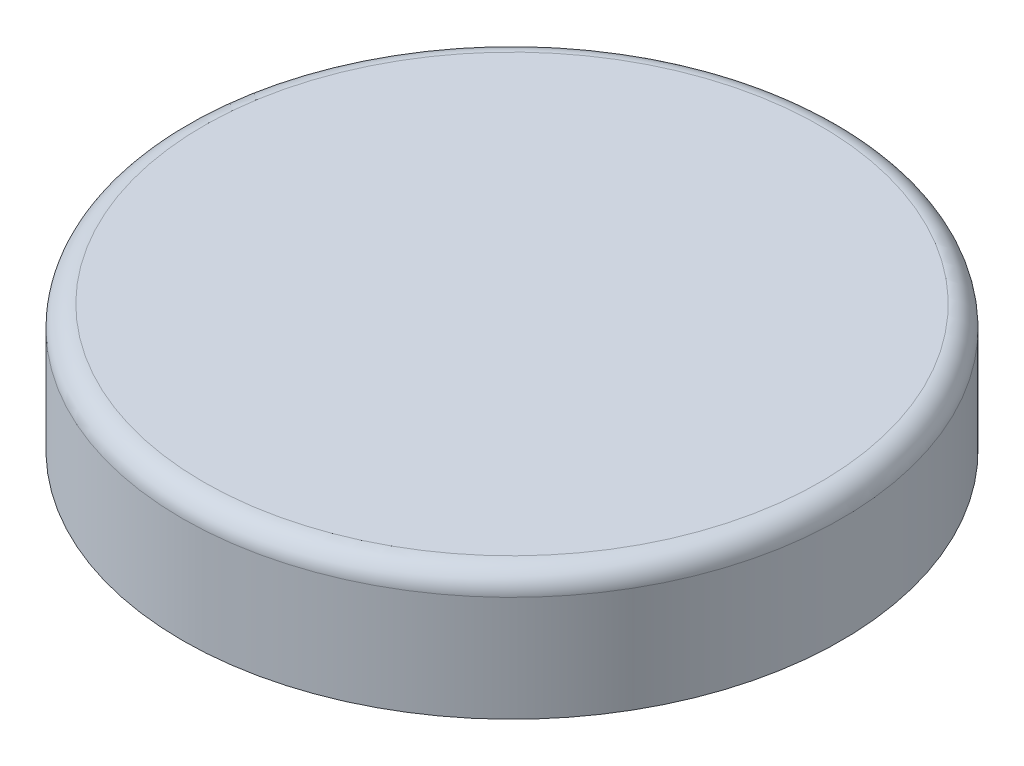
ISO-10303-21;
HEADER;
FILE_DESCRIPTION(('STEP AP214'),'2;1');
FILE_NAME('part.step','',(''),(''),'','','');
FILE_SCHEMA(('AUTOMOTIVE_DESIGN { 1 0 10303 214 1 1 1 1 }'));
ENDSEC;
DATA;
#1=APPLICATION_CONTEXT('core data for automotive mechanical design processes');
#2=APPLICATION_PROTOCOL_DEFINITION('international standard','automotive_design',2000,#1);
#3=PRODUCT_CONTEXT('',#1,'mechanical');
#4=PRODUCT('Part','Part','',(#3));
#5=PRODUCT_RELATED_PRODUCT_CATEGORY('part','',(#4));
#6=PRODUCT_DEFINITION_FORMATION('','',#4);
#7=PRODUCT_DEFINITION_CONTEXT('part definition',#1,'design');
#8=PRODUCT_DEFINITION('design','',#6,#7);
#9=PRODUCT_DEFINITION_SHAPE('','',#8);
#10=(LENGTH_UNIT() NAMED_UNIT(*) SI_UNIT(.MILLI.,.METRE.));
#11=(NAMED_UNIT(*) PLANE_ANGLE_UNIT() SI_UNIT($,.RADIAN.));
#12=(NAMED_UNIT(*) SI_UNIT($,.STERADIAN.) SOLID_ANGLE_UNIT());
#13=UNCERTAINTY_MEASURE_WITH_UNIT(LENGTH_MEASURE(1.E-05),#10,'distance_accuracy_value','');
#14=(GEOMETRIC_REPRESENTATION_CONTEXT(3) GLOBAL_UNCERTAINTY_ASSIGNED_CONTEXT((#13)) GLOBAL_UNIT_ASSIGNED_CONTEXT((#10,
#11,#12)) REPRESENTATION_CONTEXT('',''));
#15=CARTESIAN_POINT('',(0.,0.,0.));
#16=DIRECTION('',(0.,0.,1.));
#17=DIRECTION('',(1.,0.,0.));
#18=AXIS2_PLACEMENT_3D('',#15,#16,#17);
#19=CARTESIAN_POINT('',(0.,30.,0.));
#20=DIRECTION('',(0.,-1.,0.));
#21=DIRECTION('',(0.,0.,-1.));
#22=AXIS2_PLACEMENT_3D('',#19,#20,#21);
#23=CYLINDRICAL_SURFACE('',#22,78.0685472746247);
#24=CARTESIAN_POINT('',(0.,25.,0.));
#25=DIRECTION('',(0.,1.,0.));
#26=DIRECTION('',(0.,0.,1.));
#27=AXIS2_PLACEMENT_3D('',#24,#25,#26);
#28=CIRCLE('',#27,78.0685472746247);
#29=CARTESIAN_POINT('',(0.,25.,78.0685472746247));
#30=VERTEX_POINT('',#29);
#31=EDGE_CURVE('E10',#30,#30,#28,.F.);
#32=ORIENTED_EDGE('',*,*,#31,.T.);
#33=EDGE_LOOP('',(#32));
#34=FACE_BOUND('',#33,.T.);
#35=CARTESIAN_POINT('',(0.,0.,0.));
#36=DIRECTION('',(0.,1.,0.));
#37=DIRECTION('',(0.,0.,1.));
#38=AXIS2_PLACEMENT_3D('',#35,#36,#37);
#39=CIRCLE('',#38,78.0685472746247);
#40=CARTESIAN_POINT('',(0.,0.,78.0685472746247));
#41=VERTEX_POINT('',#40);
#42=EDGE_CURVE('E48',#41,#41,#39,.T.);
#43=ORIENTED_EDGE('',*,*,#42,.T.);
#44=EDGE_LOOP('',(#43));
#45=FACE_BOUND('',#44,.T.);
#46=ADVANCED_FACE('F40',(#34,#45),#23,.T.);
#47=CARTESIAN_POINT('',(0.,30.,0.));
#48=DIRECTION('',(0.,1.,0.));
#49=DIRECTION('',(0.,0.,1.));
#50=AXIS2_PLACEMENT_3D('',#47,#48,#49);
#51=PLANE('',#50);
#52=CARTESIAN_POINT('',(0.,30.,0.));
#53=DIRECTION('',(0.,1.,0.));
#54=DIRECTION('',(0.,0.,1.));
#55=AXIS2_PLACEMENT_3D('',#52,#53,#54);
#56=CIRCLE('',#55,73.0685472746247);
#57=CARTESIAN_POINT('',(0.,30.,73.0685472746247));
#58=VERTEX_POINT('',#57);
#59=EDGE_CURVE('E42',#58,#58,#56,.T.);
#60=ORIENTED_EDGE('',*,*,#59,.T.);
#61=EDGE_LOOP('',(#60));
#62=FACE_BOUND('',#61,.T.);
#63=ADVANCED_FACE('F59',(#62),#51,.T.);
#64=CARTESIAN_POINT('',(0.,0.,0.));
#65=DIRECTION('',(0.,1.,0.));
#66=DIRECTION('',(0.,0.,1.));
#67=AXIS2_PLACEMENT_3D('',#64,#65,#66);
#68=PLANE('',#67);
#69=ORIENTED_EDGE('',*,*,#42,.F.);
#70=EDGE_LOOP('',(#69));
#71=FACE_BOUND('',#70,.T.);
#72=ADVANCED_FACE('F57',(#71),#68,.F.);
#73=CARTESIAN_POINT('',(0.,25.,0.));
#74=DIRECTION('',(0.,1.,0.));
#75=DIRECTION('',(0.,0.,1.));
#76=AXIS2_PLACEMENT_3D('',#73,#74,#75);
#77=TOROIDAL_SURFACE('',#76,73.0685472746247,5.);
#78=ORIENTED_EDGE('',*,*,#31,.F.);
#79=EDGE_LOOP('',(#78));
#80=FACE_BOUND('',#79,.T.);
#81=ORIENTED_EDGE('',*,*,#59,.F.);
#82=EDGE_LOOP('',(#81));
#83=FACE_BOUND('',#82,.T.);
#84=ADVANCED_FACE('F39',(#80,#83),#77,.T.);
#85=CLOSED_SHELL('',(#46,#63,#72,#84));
#86=MANIFOLD_SOLID_BREP('B2',#85);
#87=ADVANCED_BREP_SHAPE_REPRESENTATION('',(#18,#86),#14);
#88=SHAPE_DEFINITION_REPRESENTATION(#9,#87);
ENDSEC;
END-ISO-10303-21;
